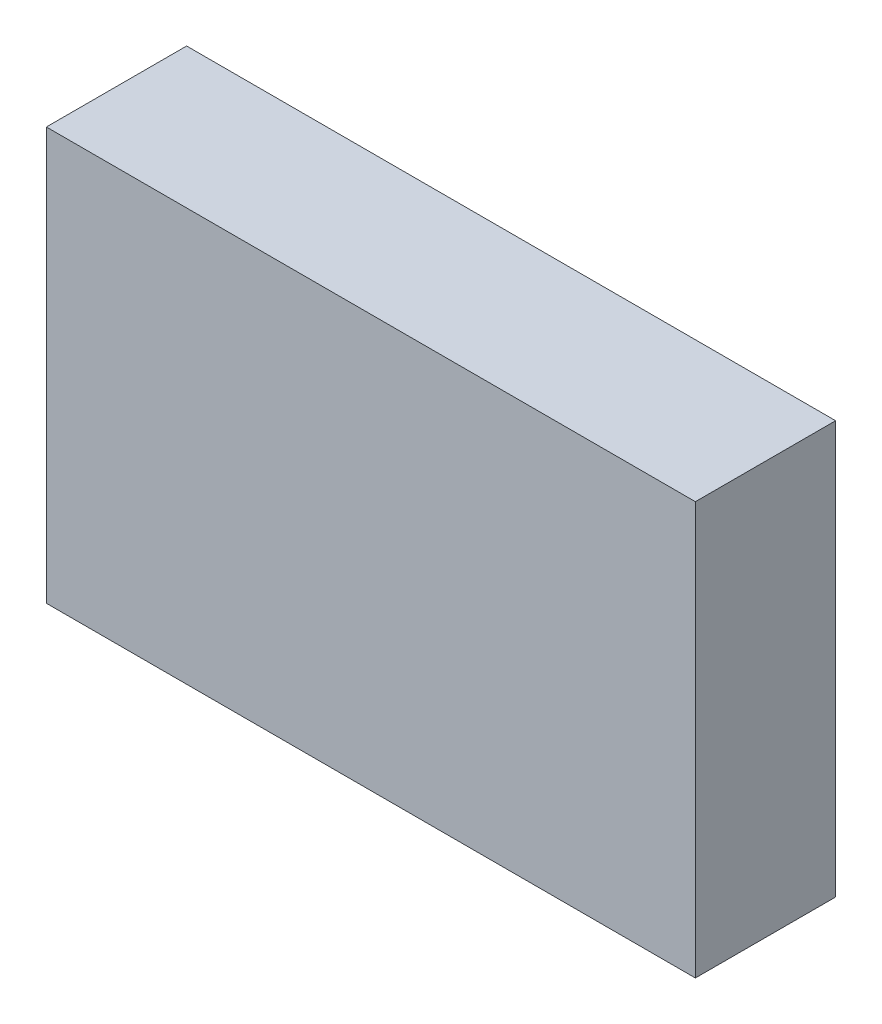
ISO-10303-21;
HEADER;
FILE_DESCRIPTION(('STEP AP214'),'2;1');
FILE_NAME('part.step','',(''),(''),'','','');
FILE_SCHEMA(('AUTOMOTIVE_DESIGN { 1 0 10303 214 1 1 1 1 }'));
ENDSEC;
DATA;
#1=APPLICATION_CONTEXT('core data for automotive mechanical design processes');
#2=APPLICATION_PROTOCOL_DEFINITION('international standard','automotive_design',2000,#1);
#3=PRODUCT_CONTEXT('',#1,'mechanical');
#4=PRODUCT('Part','Part','',(#3));
#5=PRODUCT_RELATED_PRODUCT_CATEGORY('part','',(#4));
#6=PRODUCT_DEFINITION_FORMATION('','',#4);
#7=PRODUCT_DEFINITION_CONTEXT('part definition',#1,'design');
#8=PRODUCT_DEFINITION('design','',#6,#7);
#9=PRODUCT_DEFINITION_SHAPE('','',#8);
#10=(LENGTH_UNIT() NAMED_UNIT(*) SI_UNIT(.MILLI.,.METRE.));
#11=(NAMED_UNIT(*) PLANE_ANGLE_UNIT() SI_UNIT($,.RADIAN.));
#12=(NAMED_UNIT(*) SI_UNIT($,.STERADIAN.) SOLID_ANGLE_UNIT());
#13=UNCERTAINTY_MEASURE_WITH_UNIT(LENGTH_MEASURE(1.E-05),#10,'distance_accuracy_value','');
#14=(GEOMETRIC_REPRESENTATION_CONTEXT(3) GLOBAL_UNCERTAINTY_ASSIGNED_CONTEXT((#13)) GLOBAL_UNIT_ASSIGNED_CONTEXT((#10,
#11,#12)) REPRESENTATION_CONTEXT('',''));
#15=CARTESIAN_POINT('',(0.,0.,0.));
#16=DIRECTION('',(0.,0.,1.));
#17=DIRECTION('',(1.,0.,0.));
#18=AXIS2_PLACEMENT_3D('',#15,#16,#17);
#19=CARTESIAN_POINT('',(-53.3864077669903,-33.6427184466019,25.5));
#20=DIRECTION('',(1.,0.,0.));
#21=DIRECTION('',(0.,0.,-1.));
#22=AXIS2_PLACEMENT_3D('',#19,#20,#21);
#23=PLANE('',#22);
#24=DIRECTION('',(0.,-1.,0.));
#25=VECTOR('',#24,1.);
#26=CARTESIAN_POINT('',(-53.3864077669903,-33.6427184466019,0.));
#27=LINE('',#26,#25);
#28=CARTESIAN_POINT('',(-53.3864077669903,41.3572815533981,0.));
#29=VERTEX_POINT('',#28);
#30=CARTESIAN_POINT('',(-53.3864077669903,-33.6427184466019,0.));
#31=VERTEX_POINT('',#30);
#32=EDGE_CURVE('E97',#29,#31,#27,.T.);
#33=ORIENTED_EDGE('',*,*,#32,.T.);
#34=DIRECTION('',(0.,0.,-1.));
#35=VECTOR('',#34,1.);
#36=CARTESIAN_POINT('',(-53.3864077669903,-33.6427184466019,25.5));
#37=LINE('',#36,#35);
#38=CARTESIAN_POINT('',(-53.3864077669903,-33.6427184466019,25.5));
#39=VERTEX_POINT('',#38);
#40=EDGE_CURVE('E11',#39,#31,#37,.T.);
#41=ORIENTED_EDGE('',*,*,#40,.F.);
#42=DIRECTION('',(0.,-1.,0.));
#43=VECTOR('',#42,1.);
#44=CARTESIAN_POINT('',(-53.3864077669903,-33.6427184466019,25.5));
#45=LINE('',#44,#43);
#46=CARTESIAN_POINT('',(-53.3864077669903,41.3572815533981,25.5));
#47=VERTEX_POINT('',#46);
#48=EDGE_CURVE('E85',#47,#39,#45,.T.);
#49=ORIENTED_EDGE('',*,*,#48,.F.);
#50=DIRECTION('',(0.,0.,-1.));
#51=VECTOR('',#50,1.);
#52=CARTESIAN_POINT('',(-53.3864077669903,41.3572815533981,25.5));
#53=LINE('',#52,#51);
#54=EDGE_CURVE('E93',#47,#29,#53,.T.);
#55=ORIENTED_EDGE('',*,*,#54,.T.);
#56=EDGE_LOOP('',(#33,#41,#49,#55));
#57=FACE_BOUND('',#56,.T.);
#58=ADVANCED_FACE('F34',(#57),#23,.F.);
#59=CARTESIAN_POINT('',(-53.3864077669903,-33.6427184466019,25.5));
#60=DIRECTION('',(0.,1.,0.));
#61=DIRECTION('',(0.,0.,1.));
#62=AXIS2_PLACEMENT_3D('',#59,#60,#61);
#63=PLANE('',#62);
#64=DIRECTION('',(1.,0.,0.));
#65=VECTOR('',#64,1.);
#66=CARTESIAN_POINT('',(-53.3864077669903,-33.6427184466019,0.));
#67=LINE('',#66,#65);
#68=CARTESIAN_POINT('',(64.6135922330097,-33.6427184466019,0.));
#69=VERTEX_POINT('',#68);
#70=EDGE_CURVE('E89',#31,#69,#67,.T.);
#71=ORIENTED_EDGE('',*,*,#70,.T.);
#72=DIRECTION('',(0.,0.,-1.));
#73=VECTOR('',#72,1.);
#74=CARTESIAN_POINT('',(64.6135922330097,-33.6427184466019,25.5));
#75=LINE('',#74,#73);
#76=CARTESIAN_POINT('',(64.6135922330097,-33.6427184466019,25.5));
#77=VERTEX_POINT('',#76);
#78=EDGE_CURVE('E42',#77,#69,#75,.T.);
#79=ORIENTED_EDGE('',*,*,#78,.F.);
#80=DIRECTION('',(1.,0.,0.));
#81=VECTOR('',#80,1.);
#82=CARTESIAN_POINT('',(-53.3864077669903,-33.6427184466019,25.5));
#83=LINE('',#82,#81);
#84=EDGE_CURVE('E80',#39,#77,#83,.T.);
#85=ORIENTED_EDGE('',*,*,#84,.F.);
#86=ORIENTED_EDGE('',*,*,#40,.T.);
#87=EDGE_LOOP('',(#71,#79,#85,#86));
#88=FACE_BOUND('',#87,.T.);
#89=ADVANCED_FACE('F88',(#88),#63,.F.);
#90=CARTESIAN_POINT('',(64.6135922330097,-33.6427184466019,25.5));
#91=DIRECTION('',(-1.,0.,0.));
#92=DIRECTION('',(0.,0.,1.));
#93=AXIS2_PLACEMENT_3D('',#90,#91,#92);
#94=PLANE('',#93);
#95=DIRECTION('',(0.,1.,0.));
#96=VECTOR('',#95,1.);
#97=CARTESIAN_POINT('',(64.6135922330097,-33.6427184466019,0.));
#98=LINE('',#97,#96);
#99=CARTESIAN_POINT('',(64.6135922330097,41.3572815533981,0.));
#100=VERTEX_POINT('',#99);
#101=EDGE_CURVE('E67',#69,#100,#98,.T.);
#102=ORIENTED_EDGE('',*,*,#101,.T.);
#103=DIRECTION('',(0.,0.,-1.));
#104=VECTOR('',#103,1.);
#105=CARTESIAN_POINT('',(64.6135922330097,41.3572815533981,25.5));
#106=LINE('',#105,#104);
#107=CARTESIAN_POINT('',(64.6135922330097,41.3572815533981,25.5));
#108=VERTEX_POINT('',#107);
#109=EDGE_CURVE('E90',#108,#100,#106,.T.);
#110=ORIENTED_EDGE('',*,*,#109,.F.);
#111=DIRECTION('',(0.,1.,0.));
#112=VECTOR('',#111,1.);
#113=CARTESIAN_POINT('',(64.6135922330097,-33.6427184466019,25.5));
#114=LINE('',#113,#112);
#115=EDGE_CURVE('E83',#77,#108,#114,.T.);
#116=ORIENTED_EDGE('',*,*,#115,.F.);
#117=ORIENTED_EDGE('',*,*,#78,.T.);
#118=EDGE_LOOP('',(#102,#110,#116,#117));
#119=FACE_BOUND('',#118,.T.);
#120=ADVANCED_FACE('F91',(#119),#94,.F.);
#121=CARTESIAN_POINT('',(-53.3864077669903,41.3572815533981,25.5));
#122=DIRECTION('',(0.,-1.,0.));
#123=DIRECTION('',(0.,0.,-1.));
#124=AXIS2_PLACEMENT_3D('',#121,#122,#123);
#125=PLANE('',#124);
#126=DIRECTION('',(-1.,0.,0.));
#127=VECTOR('',#126,1.);
#128=CARTESIAN_POINT('',(-53.3864077669903,41.3572815533981,0.));
#129=LINE('',#128,#127);
#130=EDGE_CURVE('E73',#100,#29,#129,.T.);
#131=ORIENTED_EDGE('',*,*,#130,.T.);
#132=ORIENTED_EDGE('',*,*,#54,.F.);
#133=DIRECTION('',(-1.,0.,0.));
#134=VECTOR('',#133,1.);
#135=CARTESIAN_POINT('',(-53.3864077669903,41.3572815533981,25.5));
#136=LINE('',#135,#134);
#137=EDGE_CURVE('E50',#108,#47,#136,.T.);
#138=ORIENTED_EDGE('',*,*,#137,.F.);
#139=ORIENTED_EDGE('',*,*,#109,.T.);
#140=EDGE_LOOP('',(#131,#132,#138,#139));
#141=FACE_BOUND('',#140,.T.);
#142=ADVANCED_FACE('F104',(#141),#125,.F.);
#143=CARTESIAN_POINT('',(0.,0.,25.5));
#144=DIRECTION('',(0.,0.,-1.));
#145=DIRECTION('',(-1.,0.,0.));
#146=AXIS2_PLACEMENT_3D('',#143,#144,#145);
#147=PLANE('',#146);
#148=ORIENTED_EDGE('',*,*,#48,.T.);
#149=ORIENTED_EDGE('',*,*,#84,.T.);
#150=ORIENTED_EDGE('',*,*,#115,.T.);
#151=ORIENTED_EDGE('',*,*,#137,.T.);
#152=EDGE_LOOP('',(#148,#149,#150,#151));
#153=FACE_BOUND('',#152,.T.);
#154=ADVANCED_FACE('F81',(#153),#147,.F.);
#155=CARTESIAN_POINT('',(0.,0.,0.));
#156=DIRECTION('',(0.,0.,-1.));
#157=DIRECTION('',(-1.,0.,0.));
#158=AXIS2_PLACEMENT_3D('',#155,#156,#157);
#159=PLANE('',#158);
#160=ORIENTED_EDGE('',*,*,#32,.F.);
#161=ORIENTED_EDGE('',*,*,#130,.F.);
#162=ORIENTED_EDGE('',*,*,#101,.F.);
#163=ORIENTED_EDGE('',*,*,#70,.F.);
#164=EDGE_LOOP('',(#160,#161,#162,#163));
#165=FACE_BOUND('',#164,.T.);
#166=ADVANCED_FACE('F107',(#165),#159,.T.);
#167=CLOSED_SHELL('',(#58,#89,#120,#142,#154,#166));
#168=MANIFOLD_SOLID_BREP('B2',#167);
#169=ADVANCED_BREP_SHAPE_REPRESENTATION('',(#18,#168),#14);
#170=SHAPE_DEFINITION_REPRESENTATION(#9,#169);
ENDSEC;
END-ISO-10303-21;
